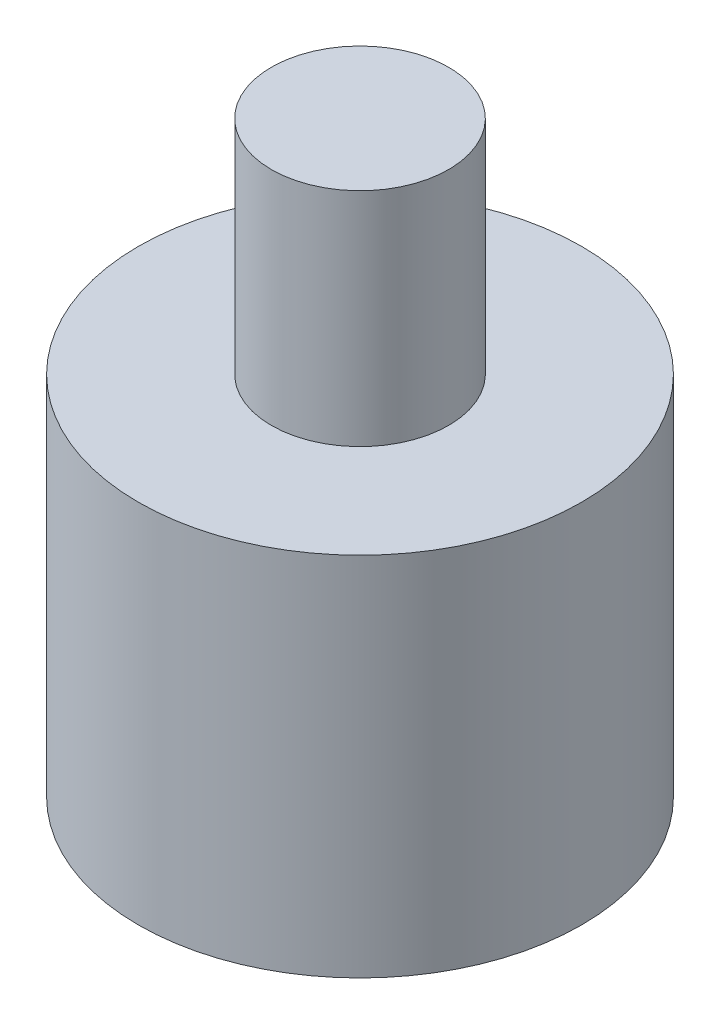
ISO-10303-21;
HEADER;
FILE_DESCRIPTION(('STEP AP214'),'2;1');
FILE_NAME('part.step','',(''),(''),'','','');
FILE_SCHEMA(('AUTOMOTIVE_DESIGN { 1 0 10303 214 1 1 1 1 }'));
ENDSEC;
DATA;
#1=APPLICATION_CONTEXT('core data for automotive mechanical design processes');
#2=APPLICATION_PROTOCOL_DEFINITION('international standard','automotive_design',2000,#1);
#3=PRODUCT_CONTEXT('',#1,'mechanical');
#4=PRODUCT('Part','Part','',(#3));
#5=PRODUCT_RELATED_PRODUCT_CATEGORY('part','',(#4));
#6=PRODUCT_DEFINITION_FORMATION('','',#4);
#7=PRODUCT_DEFINITION_CONTEXT('part definition',#1,'design');
#8=PRODUCT_DEFINITION('design','',#6,#7);
#9=PRODUCT_DEFINITION_SHAPE('','',#8);
#10=(LENGTH_UNIT() NAMED_UNIT(*) SI_UNIT(.MILLI.,.METRE.));
#11=(NAMED_UNIT(*) PLANE_ANGLE_UNIT() SI_UNIT($,.RADIAN.));
#12=(NAMED_UNIT(*) SI_UNIT($,.STERADIAN.) SOLID_ANGLE_UNIT());
#13=UNCERTAINTY_MEASURE_WITH_UNIT(LENGTH_MEASURE(1.E-05),#10,'distance_accuracy_value','');
#14=(GEOMETRIC_REPRESENTATION_CONTEXT(3) GLOBAL_UNCERTAINTY_ASSIGNED_CONTEXT((#13)) GLOBAL_UNIT_ASSIGNED_CONTEXT((#10,
#11,#12)) REPRESENTATION_CONTEXT('',''));
#15=CARTESIAN_POINT('',(0.,0.,0.));
#16=DIRECTION('',(0.,0.,1.));
#17=DIRECTION('',(1.,0.,0.));
#18=AXIS2_PLACEMENT_3D('',#15,#16,#17);
#19=CARTESIAN_POINT('',(0.,265.2,0.));
#20=DIRECTION('',(0.,-1.,0.));
#21=DIRECTION('',(0.,0.,-1.));
#22=AXIS2_PLACEMENT_3D('',#19,#20,#21);
#23=CYLINDRICAL_SURFACE('',#22,40.);
#24=CARTESIAN_POINT('',(0.,265.2,0.));
#25=DIRECTION('',(0.,1.,0.));
#26=DIRECTION('',(0.,0.,1.));
#27=AXIS2_PLACEMENT_3D('',#24,#25,#26);
#28=CIRCLE('',#27,40.);
#29=CARTESIAN_POINT('',(0.,265.2,40.));
#30=VERTEX_POINT('',#29);
#31=EDGE_CURVE('E11',#30,#30,#28,.T.);
#32=ORIENTED_EDGE('',*,*,#31,.F.);
#33=EDGE_LOOP('',(#32));
#34=FACE_BOUND('',#33,.T.);
#35=CARTESIAN_POINT('',(0.,165.2,0.));
#36=DIRECTION('',(0.,1.,0.));
#37=DIRECTION('',(0.,0.,1.));
#38=AXIS2_PLACEMENT_3D('',#35,#36,#37);
#39=CIRCLE('',#38,40.);
#40=CARTESIAN_POINT('',(0.,165.2,40.));
#41=VERTEX_POINT('',#40);
#42=EDGE_CURVE('E45',#41,#41,#39,.T.);
#43=ORIENTED_EDGE('',*,*,#42,.T.);
#44=EDGE_LOOP('',(#43));
#45=FACE_BOUND('',#44,.T.);
#46=ADVANCED_FACE('F42',(#34,#45),#23,.T.);
#47=CARTESIAN_POINT('',(0.,265.2,0.));
#48=DIRECTION('',(0.,1.,0.));
#49=DIRECTION('',(0.,0.,1.));
#50=AXIS2_PLACEMENT_3D('',#47,#48,#49);
#51=PLANE('',#50);
#52=ORIENTED_EDGE('',*,*,#31,.T.);
#53=EDGE_LOOP('',(#52));
#54=FACE_BOUND('',#53,.T.);
#55=ADVANCED_FACE('F57',(#54),#51,.T.);
#56=CARTESIAN_POINT('',(0.,165.2,0.));
#57=DIRECTION('',(0.,1.,0.));
#58=DIRECTION('',(0.,0.,1.));
#59=AXIS2_PLACEMENT_3D('',#56,#57,#58);
#60=PLANE('',#59);
#61=ORIENTED_EDGE('',*,*,#42,.F.);
#62=EDGE_LOOP('',(#61));
#63=FACE_BOUND('',#62,.T.);
#64=ADVANCED_FACE('F55',(#63),#60,.F.);
#65=CLOSED_SHELL('',(#46,#55,#64));
#66=MANIFOLD_SOLID_BREP('B2',#65);
#67=CARTESIAN_POINT('',(0.,165.2,0.));
#68=DIRECTION('',(0.,-1.,0.));
#69=DIRECTION('',(0.,0.,-1.));
#70=AXIS2_PLACEMENT_3D('',#67,#68,#69);
#71=CYLINDRICAL_SURFACE('',#70,100.);
#72=CARTESIAN_POINT('',(0.,165.2,0.));
#73=DIRECTION('',(0.,1.,0.));
#74=DIRECTION('',(0.,0.,1.));
#75=AXIS2_PLACEMENT_3D('',#72,#73,#74);
#76=CIRCLE('',#75,100.);
#77=CARTESIAN_POINT('',(0.,165.2,-100.));
#78=VERTEX_POINT('',#77);
#79=EDGE_CURVE('E41',#78,#78,#76,.T.);
#80=CARTESIAN_POINT('',(0.,0.,0.));
#81=DIRECTION('',(0.,1.,0.));
#82=DIRECTION('',(0.,0.,1.));
#83=AXIS2_PLACEMENT_3D('',#80,#81,#82);
#84=CIRCLE('',#83,100.);
#85=CARTESIAN_POINT('',(0.,0.,-100.));
#86=VERTEX_POINT('',#85);
#87=EDGE_CURVE('E85',#86,#86,#84,.T.);
#88=CARTESIAN_POINT('',(0.,165.2,-100.));
#89=CARTESIAN_POINT('',(0.,163.479166666667,-100.));
#90=CARTESIAN_POINT('',(0.,161.758333333333,-100.));
#91=CARTESIAN_POINT('',(0.,158.316666666667,-100.));
#92=CARTESIAN_POINT('',(0.,156.595833333333,-100.));
#93=CARTESIAN_POINT('',(0.,153.154166666667,-100.));
#94=CARTESIAN_POINT('',(0.,151.433333333333,-100.));
#95=CARTESIAN_POINT('',(0.,147.991666666667,-100.));
#96=CARTESIAN_POINT('',(0.,146.270833333333,-100.));
#97=CARTESIAN_POINT('',(0.,142.829166666667,-100.));
#98=CARTESIAN_POINT('',(0.,141.108333333333,-100.));
#99=CARTESIAN_POINT('',(0.,137.666666666667,-100.));
#100=CARTESIAN_POINT('',(0.,135.945833333333,-100.));
#101=CARTESIAN_POINT('',(0.,132.504166666667,-100.));
#102=CARTESIAN_POINT('',(0.,130.783333333333,-100.));
#103=CARTESIAN_POINT('',(0.,127.341666666667,-100.));
#104=CARTESIAN_POINT('',(0.,125.620833333333,-100.));
#105=CARTESIAN_POINT('',(0.,122.179166666667,-100.));
#106=CARTESIAN_POINT('',(0.,120.458333333333,-100.));
#107=CARTESIAN_POINT('',(0.,117.016666666667,-100.));
#108=CARTESIAN_POINT('',(0.,115.295833333333,-100.));
#109=CARTESIAN_POINT('',(0.,111.854166666667,-100.));
#110=CARTESIAN_POINT('',(0.,110.133333333333,-100.));
#111=CARTESIAN_POINT('',(0.,106.691666666667,-100.));
#112=CARTESIAN_POINT('',(0.,104.970833333333,-100.));
#113=CARTESIAN_POINT('',(0.,101.529166666667,-100.));
#114=CARTESIAN_POINT('',(0.,99.8083333333333,-100.));
#115=CARTESIAN_POINT('',(0.,96.3666666666666,-100.));
#116=CARTESIAN_POINT('',(0.,94.6458333333333,-100.));
#117=CARTESIAN_POINT('',(0.,91.2041666666666,-100.));
#118=CARTESIAN_POINT('',(0.,89.4833333333333,-100.));
#119=CARTESIAN_POINT('',(0.,86.0416666666666,-100.));
#120=CARTESIAN_POINT('',(0.,84.3208333333333,-100.));
#121=CARTESIAN_POINT('',(0.,80.8791666666666,-100.));
#122=CARTESIAN_POINT('',(0.,79.1583333333333,-100.));
#123=CARTESIAN_POINT('',(0.,75.7166666666666,-100.));
#124=CARTESIAN_POINT('',(0.,73.9958333333333,-100.));
#125=CARTESIAN_POINT('',(0.,70.5541666666666,-100.));
#126=CARTESIAN_POINT('',(0.,68.8333333333333,-100.));
#127=CARTESIAN_POINT('',(0.,65.3916666666666,-100.));
#128=CARTESIAN_POINT('',(0.,63.6708333333333,-100.));
#129=CARTESIAN_POINT('',(0.,60.2291666666666,-100.));
#130=CARTESIAN_POINT('',(0.,58.5083333333333,-100.));
#131=CARTESIAN_POINT('',(0.,55.0666666666666,-100.));
#132=CARTESIAN_POINT('',(0.,53.3458333333333,-100.));
#133=CARTESIAN_POINT('',(0.,49.9041666666666,-100.));
#134=CARTESIAN_POINT('',(0.,48.1833333333333,-100.));
#135=CARTESIAN_POINT('',(0.,44.7416666666666,-100.));
#136=CARTESIAN_POINT('',(0.,43.0208333333333,-100.));
#137=CARTESIAN_POINT('',(0.,39.5791666666666,-100.));
#138=CARTESIAN_POINT('',(0.,37.8583333333333,-100.));
#139=CARTESIAN_POINT('',(0.,34.4166666666667,-100.));
#140=CARTESIAN_POINT('',(0.,32.6958333333333,-100.));
#141=CARTESIAN_POINT('',(0.,29.2541666666667,-100.));
#142=CARTESIAN_POINT('',(0.,27.5333333333333,-100.));
#143=CARTESIAN_POINT('',(0.,24.0916666666667,-100.));
#144=CARTESIAN_POINT('',(0.,22.3708333333333,-100.));
#145=CARTESIAN_POINT('',(0.,18.9291666666667,-100.));
#146=CARTESIAN_POINT('',(0.,17.2083333333333,-100.));
#147=CARTESIAN_POINT('',(0.,13.7666666666667,-100.));
#148=CARTESIAN_POINT('',(0.,12.0458333333333,-100.));
#149=CARTESIAN_POINT('',(0.,8.60416666666667,-100.));
#150=CARTESIAN_POINT('',(0.,6.88333333333334,-100.));
#151=CARTESIAN_POINT('',(0.,3.44166666666668,-100.));
#152=CARTESIAN_POINT('',(0.,1.72083333333334,-100.));
#153=CARTESIAN_POINT('',(0.,0.,-100.));
#154=B_SPLINE_CURVE_WITH_KNOTS('',3,(#88,#89,#90,#91,#92,#93,#94,#95,#96,#97,#98,#99,#100,#101,
#102,#103,#104,#105,#106,#107,#108,#109,#110,#111,#112,#113,#114,#115,#116,#117,#118,#119,#120,
#121,#122,#123,#124,#125,#126,#127,#128,#129,#130,#131,#132,#133,#134,#135,#136,#137,#138,#139,
#140,#141,#142,#143,#144,#145,#146,#147,#148,#149,#150,#151,#152,#153),.UNSPECIFIED.,.F.,.F.,(4,
2,2,2,2,2,2,2,2,2,2,2,2,2,2,2,2,2,2,2,2,2,2,2,2,2,2,2,2,2,2,2,4),(0.,5.16250000000001,10.325,
15.4875,20.65,25.8125,30.975,36.1375,41.3,46.4625,51.625,56.7875,61.95,67.1125,72.275,77.4375,
82.6,87.7625,92.925,98.0875,103.25,108.4125,113.575,118.7375,123.9,129.0625,134.225,139.3875,
144.55,149.7125,154.875,160.0375,165.2),.UNSPECIFIED.);
#155=EDGE_CURVE('BSEAM82',#78,#86,#154,.T.);
#156=ORIENTED_EDGE('',*,*,#79,.F.);
#157=ORIENTED_EDGE('',*,*,#87,.T.);
#158=ORIENTED_EDGE('',*,*,#155,.T.);
#159=ORIENTED_EDGE('',*,*,#155,.F.);
#160=EDGE_LOOP('',(#156,#158,#157,#159));
#161=FACE_BOUND('',#160,.T.);
#162=ADVANCED_FACE('F82',(#161),#71,.T.);
#163=CARTESIAN_POINT('',(0.,165.2,0.));
#164=DIRECTION('',(0.,1.,0.));
#165=DIRECTION('',(0.,0.,1.));
#166=AXIS2_PLACEMENT_3D('',#163,#164,#165);
#167=PLANE('',#166);
#168=ORIENTED_EDGE('',*,*,#79,.T.);
#169=EDGE_LOOP('',(#168));
#170=FACE_BOUND('',#169,.T.);
#171=ADVANCED_FACE('F97',(#170),#167,.T.);
#172=CARTESIAN_POINT('',(0.,0.,0.));
#173=DIRECTION('',(0.,1.,0.));
#174=DIRECTION('',(0.,0.,1.));
#175=AXIS2_PLACEMENT_3D('',#172,#173,#174);
#176=PLANE('',#175);
#177=ORIENTED_EDGE('',*,*,#87,.F.);
#178=EDGE_LOOP('',(#177));
#179=FACE_BOUND('',#178,.T.);
#180=ADVANCED_FACE('F95',(#179),#176,.F.);
#181=CLOSED_SHELL('',(#162,#171,#180));
#182=MANIFOLD_SOLID_BREP('B6',#181);
#183=ADVANCED_BREP_SHAPE_REPRESENTATION('',(#18,#66,#182),#14);
#184=SHAPE_DEFINITION_REPRESENTATION(#9,#183);
ENDSEC;
END-ISO-10303-21;
